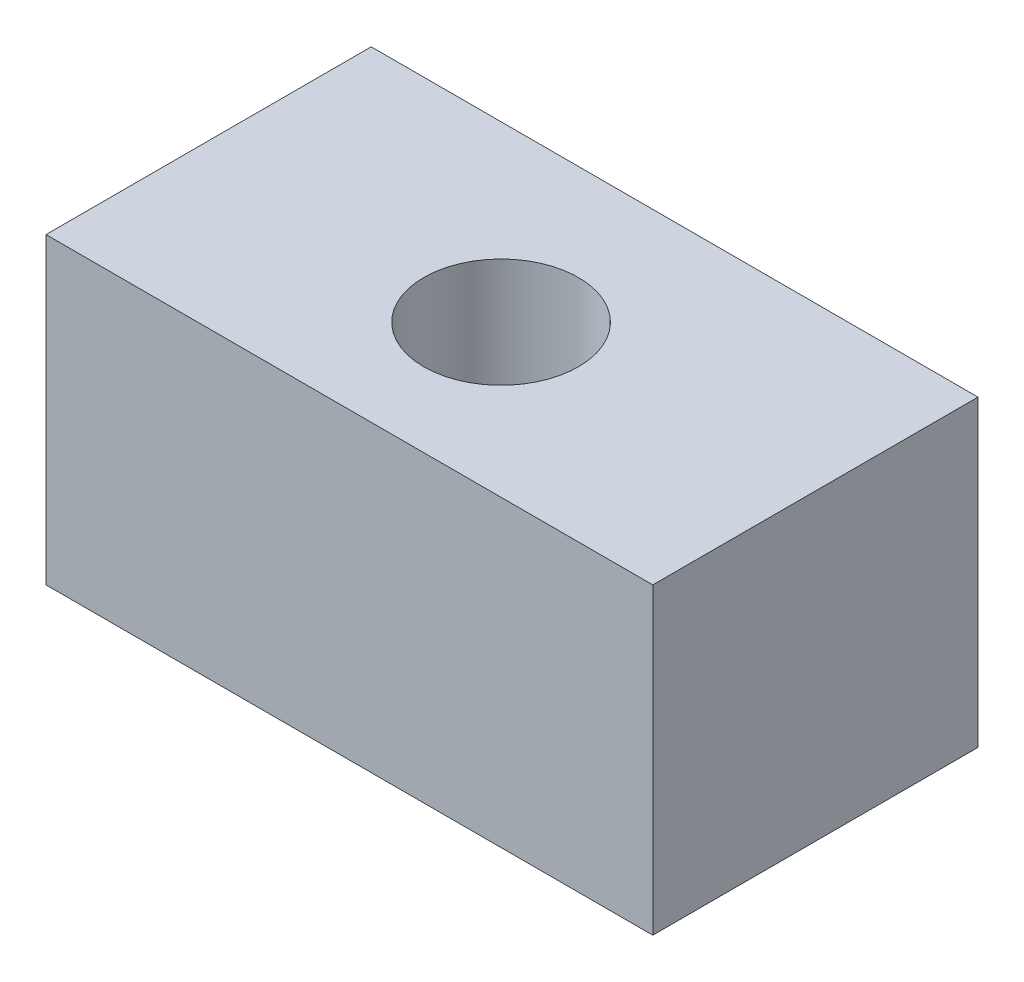
ISO-10303-21;
HEADER;
FILE_DESCRIPTION(('STEP AP214'),'2;1');
FILE_NAME('part.step','',(''),(''),'','','');
FILE_SCHEMA(('AUTOMOTIVE_DESIGN { 1 0 10303 214 1 1 1 1 }'));
ENDSEC;
DATA;
#1=APPLICATION_CONTEXT('core data for automotive mechanical design processes');
#2=APPLICATION_PROTOCOL_DEFINITION('international standard','automotive_design',2000,#1);
#3=PRODUCT_CONTEXT('',#1,'mechanical');
#4=PRODUCT('Part','Part','',(#3));
#5=PRODUCT_RELATED_PRODUCT_CATEGORY('part','',(#4));
#6=PRODUCT_DEFINITION_FORMATION('','',#4);
#7=PRODUCT_DEFINITION_CONTEXT('part definition',#1,'design');
#8=PRODUCT_DEFINITION('design','',#6,#7);
#9=PRODUCT_DEFINITION_SHAPE('','',#8);
#10=(LENGTH_UNIT() NAMED_UNIT(*) SI_UNIT(.MILLI.,.METRE.));
#11=(NAMED_UNIT(*) PLANE_ANGLE_UNIT() SI_UNIT($,.RADIAN.));
#12=(NAMED_UNIT(*) SI_UNIT($,.STERADIAN.) SOLID_ANGLE_UNIT());
#13=UNCERTAINTY_MEASURE_WITH_UNIT(LENGTH_MEASURE(1.E-05),#10,'distance_accuracy_value','');
#14=(GEOMETRIC_REPRESENTATION_CONTEXT(3) GLOBAL_UNCERTAINTY_ASSIGNED_CONTEXT((#13)) GLOBAL_UNIT_ASSIGNED_CONTEXT((#10,
#11,#12)) REPRESENTATION_CONTEXT('',''));
#15=CARTESIAN_POINT('',(0.,0.,0.));
#16=DIRECTION('',(0.,0.,1.));
#17=DIRECTION('',(1.,0.,0.));
#18=AXIS2_PLACEMENT_3D('',#15,#16,#17);
#19=CARTESIAN_POINT('',(-25.4,12.7,27.2288));
#20=DIRECTION('',(1.,0.,0.));
#21=DIRECTION('',(0.,0.,-1.));
#22=AXIS2_PLACEMENT_3D('',#19,#20,#21);
#23=PLANE('',#22);
#24=DIRECTION('',(0.,-1.,0.));
#25=VECTOR('',#24,1.);
#26=CARTESIAN_POINT('',(-25.4,12.7,0.));
#27=LINE('',#26,#25);
#28=CARTESIAN_POINT('',(-25.4,12.7,0.));
#29=VERTEX_POINT('',#28);
#30=CARTESIAN_POINT('',(-25.4,-12.7,0.));
#31=VERTEX_POINT('',#30);
#32=EDGE_CURVE('E113',#29,#31,#27,.T.);
#33=ORIENTED_EDGE('',*,*,#32,.T.);
#34=DIRECTION('',(0.,0.,-1.));
#35=VECTOR('',#34,1.);
#36=CARTESIAN_POINT('',(-25.4,-12.7,27.2288));
#37=LINE('',#36,#35);
#38=CARTESIAN_POINT('',(-25.4,-12.7,27.2288));
#39=VERTEX_POINT('',#38);
#40=EDGE_CURVE('E11',#39,#31,#37,.T.);
#41=ORIENTED_EDGE('',*,*,#40,.F.);
#42=DIRECTION('',(0.,-1.,0.));
#43=VECTOR('',#42,1.);
#44=CARTESIAN_POINT('',(-25.4,12.7,27.2288));
#45=LINE('',#44,#43);
#46=CARTESIAN_POINT('',(-25.4,12.7,27.2288));
#47=VERTEX_POINT('',#46);
#48=EDGE_CURVE('E97',#47,#39,#45,.T.);
#49=ORIENTED_EDGE('',*,*,#48,.F.);
#50=DIRECTION('',(0.,0.,-1.));
#51=VECTOR('',#50,1.);
#52=CARTESIAN_POINT('',(-25.4,12.7,27.2288));
#53=LINE('',#52,#51);
#54=EDGE_CURVE('E109',#47,#29,#53,.T.);
#55=ORIENTED_EDGE('',*,*,#54,.T.);
#56=EDGE_LOOP('',(#33,#41,#49,#55));
#57=FACE_BOUND('',#56,.T.);
#58=ADVANCED_FACE('F45',(#57),#23,.F.);
#59=CARTESIAN_POINT('',(-25.4,-12.7,27.2288));
#60=DIRECTION('',(0.,1.,0.));
#61=DIRECTION('',(0.,0.,1.));
#62=AXIS2_PLACEMENT_3D('',#59,#60,#61);
#63=PLANE('',#62);
#64=DIRECTION('',(1.,0.,0.));
#65=VECTOR('',#64,1.);
#66=CARTESIAN_POINT('',(-25.4,-12.7,0.));
#67=LINE('',#66,#65);
#68=CARTESIAN_POINT('',(25.4,-12.7,0.));
#69=VERTEX_POINT('',#68);
#70=EDGE_CURVE('E102',#31,#69,#67,.T.);
#71=ORIENTED_EDGE('',*,*,#70,.T.);
#72=DIRECTION('',(0.,0.,-1.));
#73=VECTOR('',#72,1.);
#74=CARTESIAN_POINT('',(25.4,-12.7,27.2288));
#75=LINE('',#74,#73);
#76=CARTESIAN_POINT('',(25.4,-12.7,27.2288));
#77=VERTEX_POINT('',#76);
#78=EDGE_CURVE('E54',#77,#69,#75,.T.);
#79=ORIENTED_EDGE('',*,*,#78,.F.);
#80=DIRECTION('',(1.,0.,0.));
#81=VECTOR('',#80,1.);
#82=CARTESIAN_POINT('',(-25.4,-12.7,27.2288));
#83=LINE('',#82,#81);
#84=EDGE_CURVE('E92',#39,#77,#83,.T.);
#85=ORIENTED_EDGE('',*,*,#84,.F.);
#86=ORIENTED_EDGE('',*,*,#40,.T.);
#87=EDGE_LOOP('',(#71,#79,#85,#86));
#88=FACE_BOUND('',#87,.T.);
#89=ADVANCED_FACE('F101',(#88),#63,.F.);
#90=CARTESIAN_POINT('',(25.4,12.7,27.2288));
#91=DIRECTION('',(-1.,0.,0.));
#92=DIRECTION('',(0.,0.,1.));
#93=AXIS2_PLACEMENT_3D('',#90,#91,#92);
#94=PLANE('',#93);
#95=DIRECTION('',(0.,1.,0.));
#96=VECTOR('',#95,1.);
#97=CARTESIAN_POINT('',(25.4,12.7,0.));
#98=LINE('',#97,#96);
#99=CARTESIAN_POINT('',(25.4,12.7,0.));
#100=VERTEX_POINT('',#99);
#101=EDGE_CURVE('E79',#69,#100,#98,.T.);
#102=ORIENTED_EDGE('',*,*,#101,.T.);
#103=DIRECTION('',(0.,0.,-1.));
#104=VECTOR('',#103,1.);
#105=CARTESIAN_POINT('',(25.4,12.7,27.2288));
#106=LINE('',#105,#104);
#107=CARTESIAN_POINT('',(25.4,12.7,27.2288));
#108=VERTEX_POINT('',#107);
#109=EDGE_CURVE('E104',#108,#100,#106,.T.);
#110=ORIENTED_EDGE('',*,*,#109,.F.);
#111=DIRECTION('',(0.,1.,0.));
#112=VECTOR('',#111,1.);
#113=CARTESIAN_POINT('',(25.4,12.7,27.2288));
#114=LINE('',#113,#112);
#115=EDGE_CURVE('E95',#77,#108,#114,.T.);
#116=ORIENTED_EDGE('',*,*,#115,.F.);
#117=ORIENTED_EDGE('',*,*,#78,.T.);
#118=EDGE_LOOP('',(#102,#110,#116,#117));
#119=FACE_BOUND('',#118,.T.);
#120=ADVANCED_FACE('F105',(#119),#94,.F.);
#121=CARTESIAN_POINT('',(-25.4,12.7,27.2288));
#122=DIRECTION('',(0.,-1.,0.));
#123=DIRECTION('',(0.,0.,-1.));
#124=AXIS2_PLACEMENT_3D('',#121,#122,#123);
#125=PLANE('',#124);
#126=CARTESIAN_POINT('',(0.,12.7,14.5288));
#127=DIRECTION('',(0.,1.,0.));
#128=DIRECTION('',(0.,0.,1.));
#129=AXIS2_PLACEMENT_3D('',#126,#127,#128);
#130=CIRCLE('',#129,6.477);
#131=CARTESIAN_POINT('',(0.,12.7,21.0058));
#132=VERTEX_POINT('',#131);
#133=EDGE_CURVE('E134',#132,#132,#130,.T.);
#134=ORIENTED_EDGE('',*,*,#133,.F.);
#135=EDGE_LOOP('',(#134));
#136=FACE_BOUND('',#135,.T.);
#137=DIRECTION('',(-1.,0.,0.));
#138=VECTOR('',#137,1.);
#139=CARTESIAN_POINT('',(-25.4,12.7,0.));
#140=LINE('',#139,#138);
#141=EDGE_CURVE('E85',#100,#29,#140,.T.);
#142=ORIENTED_EDGE('',*,*,#141,.T.);
#143=ORIENTED_EDGE('',*,*,#54,.F.);
#144=DIRECTION('',(-1.,0.,0.));
#145=VECTOR('',#144,1.);
#146=CARTESIAN_POINT('',(-25.4,12.7,27.2288));
#147=LINE('',#146,#145);
#148=EDGE_CURVE('E62',#108,#47,#147,.T.);
#149=ORIENTED_EDGE('',*,*,#148,.F.);
#150=ORIENTED_EDGE('',*,*,#109,.T.);
#151=EDGE_LOOP('',(#142,#143,#149,#150));
#152=FACE_BOUND('',#151,.T.);
#153=ADVANCED_FACE('F127',(#136,#152),#125,.F.);
#154=CARTESIAN_POINT('',(0.,0.,27.2288));
#155=DIRECTION('',(0.,0.,1.));
#156=DIRECTION('',(1.,0.,0.));
#157=AXIS2_PLACEMENT_3D('',#154,#155,#156);
#158=PLANE('',#157);
#159=ORIENTED_EDGE('',*,*,#48,.T.);
#160=ORIENTED_EDGE('',*,*,#84,.T.);
#161=ORIENTED_EDGE('',*,*,#115,.T.);
#162=ORIENTED_EDGE('',*,*,#148,.T.);
#163=EDGE_LOOP('',(#159,#160,#161,#162));
#164=FACE_BOUND('',#163,.T.);
#165=ADVANCED_FACE('F93',(#164),#158,.T.);
#166=CARTESIAN_POINT('',(0.,0.,0.));
#167=DIRECTION('',(0.,0.,1.));
#168=DIRECTION('',(1.,0.,0.));
#169=AXIS2_PLACEMENT_3D('',#166,#167,#168);
#170=PLANE('',#169);
#171=ORIENTED_EDGE('',*,*,#32,.F.);
#172=ORIENTED_EDGE('',*,*,#141,.F.);
#173=ORIENTED_EDGE('',*,*,#101,.F.);
#174=ORIENTED_EDGE('',*,*,#70,.F.);
#175=EDGE_LOOP('',(#171,#172,#173,#174));
#176=FACE_BOUND('',#175,.T.);
#177=ADVANCED_FACE('F130',(#176),#170,.F.);
#178=CARTESIAN_POINT('',(0.,-2.54,14.5288));
#179=DIRECTION('',(0.,1.,0.));
#180=DIRECTION('',(0.,0.,1.));
#181=AXIS2_PLACEMENT_3D('',#178,#179,#180);
#182=CYLINDRICAL_SURFACE('',#181,6.477);
#183=CARTESIAN_POINT('',(0.,-2.54,14.5288));
#184=DIRECTION('',(0.,1.,0.));
#185=DIRECTION('',(0.,0.,1.));
#186=AXIS2_PLACEMENT_3D('',#183,#184,#185);
#187=CIRCLE('',#186,6.477);
#188=CARTESIAN_POINT('',(0.,-2.54,21.0058));
#189=VERTEX_POINT('',#188);
#190=EDGE_CURVE('E117',#189,#189,#187,.T.);
#191=CARTESIAN_POINT('',(0.,-2.54,21.0058));
#192=CARTESIAN_POINT('',(0.,-2.38125,21.0058));
#193=CARTESIAN_POINT('',(0.,-2.2225,21.0058));
#194=CARTESIAN_POINT('',(0.,-1.905,21.0058));
#195=CARTESIAN_POINT('',(0.,-1.74625,21.0058));
#196=CARTESIAN_POINT('',(0.,-1.42875,21.0058));
#197=CARTESIAN_POINT('',(0.,-1.27,21.0058));
#198=CARTESIAN_POINT('',(0.,-0.952499999999999,21.0058));
#199=CARTESIAN_POINT('',(0.,-0.793749999999999,21.0058));
#200=CARTESIAN_POINT('',(0.,-0.476249999999999,21.0058));
#201=CARTESIAN_POINT('',(0.,-0.317499999999999,21.0058));
#202=CARTESIAN_POINT('',(0.,0.,21.0058));
#203=CARTESIAN_POINT('',(0.,0.158750000000001,21.0058));
#204=CARTESIAN_POINT('',(0.,0.476250000000001,21.0058));
#205=CARTESIAN_POINT('',(0.,0.635000000000001,21.0058));
#206=CARTESIAN_POINT('',(0.,0.952500000000001,21.0058));
#207=CARTESIAN_POINT('',(0.,1.11125,21.0058));
#208=CARTESIAN_POINT('',(0.,1.42875,21.0058));
#209=CARTESIAN_POINT('',(0.,1.5875,21.0058));
#210=CARTESIAN_POINT('',(0.,1.905,21.0058));
#211=CARTESIAN_POINT('',(0.,2.06375,21.0058));
#212=CARTESIAN_POINT('',(0.,2.38125,21.0058));
#213=CARTESIAN_POINT('',(0.,2.54,21.0058));
#214=CARTESIAN_POINT('',(0.,2.8575,21.0058));
#215=CARTESIAN_POINT('',(0.,3.01625,21.0058));
#216=CARTESIAN_POINT('',(0.,3.33375,21.0058));
#217=CARTESIAN_POINT('',(0.,3.4925,21.0058));
#218=CARTESIAN_POINT('',(0.,3.81,21.0058));
#219=CARTESIAN_POINT('',(0.,3.96875,21.0058));
#220=CARTESIAN_POINT('',(0.,4.28625,21.0058));
#221=CARTESIAN_POINT('',(0.,4.445,21.0058));
#222=CARTESIAN_POINT('',(0.,4.7625,21.0058));
#223=CARTESIAN_POINT('',(0.,4.92125,21.0058));
#224=CARTESIAN_POINT('',(0.,5.23875,21.0058));
#225=CARTESIAN_POINT('',(0.,5.3975,21.0058));
#226=CARTESIAN_POINT('',(0.,5.715,21.0058));
#227=CARTESIAN_POINT('',(0.,5.87375,21.0058));
#228=CARTESIAN_POINT('',(0.,6.19125,21.0058));
#229=CARTESIAN_POINT('',(0.,6.35,21.0058));
#230=CARTESIAN_POINT('',(0.,6.6675,21.0058));
#231=CARTESIAN_POINT('',(0.,6.82625,21.0058));
#232=CARTESIAN_POINT('',(0.,7.14375,21.0058));
#233=CARTESIAN_POINT('',(0.,7.3025,21.0058));
#234=CARTESIAN_POINT('',(0.,7.62,21.0058));
#235=CARTESIAN_POINT('',(0.,7.77875,21.0058));
#236=CARTESIAN_POINT('',(0.,8.09625,21.0058));
#237=CARTESIAN_POINT('',(0.,8.255,21.0058));
#238=CARTESIAN_POINT('',(0.,8.5725,21.0058));
#239=CARTESIAN_POINT('',(0.,8.73125,21.0058));
#240=CARTESIAN_POINT('',(0.,9.04875,21.0058));
#241=CARTESIAN_POINT('',(0.,9.2075,21.0058));
#242=CARTESIAN_POINT('',(0.,9.525,21.0058));
#243=CARTESIAN_POINT('',(0.,9.68375,21.0058));
#244=CARTESIAN_POINT('',(0.,10.00125,21.0058));
#245=CARTESIAN_POINT('',(0.,10.16,21.0058));
#246=CARTESIAN_POINT('',(0.,10.4775,21.0058));
#247=CARTESIAN_POINT('',(0.,10.63625,21.0058));
#248=CARTESIAN_POINT('',(0.,10.95375,21.0058));
#249=CARTESIAN_POINT('',(0.,11.1125,21.0058));
#250=CARTESIAN_POINT('',(0.,11.43,21.0058));
#251=CARTESIAN_POINT('',(0.,11.58875,21.0058));
#252=CARTESIAN_POINT('',(0.,11.90625,21.0058));
#253=CARTESIAN_POINT('',(0.,12.065,21.0058));
#254=CARTESIAN_POINT('',(0.,12.3825,21.0058));
#255=CARTESIAN_POINT('',(0.,12.54125,21.0058));
#256=CARTESIAN_POINT('',(0.,12.7,21.0058));
#257=B_SPLINE_CURVE_WITH_KNOTS('',3,(#191,#192,#193,#194,#195,#196,#197,#198,#199,#200,#201,
#202,#203,#204,#205,#206,#207,#208,#209,#210,#211,#212,#213,#214,#215,#216,#217,#218,#219,#220,
#221,#222,#223,#224,#225,#226,#227,#228,#229,#230,#231,#232,#233,#234,#235,#236,#237,#238,#239,
#240,#241,#242,#243,#244,#245,#246,#247,#248,#249,#250,#251,#252,#253,#254,#255,#256),
.UNSPECIFIED.,.F.,.F.,(4,2,2,2,2,2,2,2,2,2,2,2,2,2,2,2,2,2,2,2,2,2,2,2,2,2,2,2,2,2,2,2,4),(0.,
0.47625,0.9525,1.42875,1.905,2.38125,2.8575,3.33375,3.81,4.28625,4.7625,5.23875,5.715,6.19125,
6.6675,7.14375,7.62,8.09625,8.5725,9.04875,9.525,10.00125,10.4775,10.95375,11.43,11.90625,
12.3825,12.85875,13.335,13.81125,14.2875,14.76375,15.24),.UNSPECIFIED.);
#258=EDGE_CURVE('BSEAM144',#189,#132,#257,.T.);
#259=ORIENTED_EDGE('',*,*,#190,.F.);
#260=ORIENTED_EDGE('',*,*,#133,.T.);
#261=ORIENTED_EDGE('',*,*,#258,.T.);
#262=ORIENTED_EDGE('',*,*,#258,.F.);
#263=EDGE_LOOP('',(#259,#261,#260,#262));
#264=FACE_BOUND('',#263,.T.);
#265=ADVANCED_FACE('F144',(#264),#182,.F.);
#266=CARTESIAN_POINT('',(0.,-2.54,14.5288));
#267=DIRECTION('',(0.,1.,0.));
#268=DIRECTION('',(0.,0.,1.));
#269=AXIS2_PLACEMENT_3D('',#266,#267,#268);
#270=PLANE('',#269);
#271=ORIENTED_EDGE('',*,*,#190,.T.);
#272=EDGE_LOOP('',(#271));
#273=FACE_BOUND('',#272,.T.);
#274=ADVANCED_FACE('F142',(#273),#270,.T.);
#275=CLOSED_SHELL('',(#58,#89,#120,#153,#165,#177,#265,#274));
#276=MANIFOLD_SOLID_BREP('B2',#275);
#277=ADVANCED_BREP_SHAPE_REPRESENTATION('',(#18,#276),#14);
#278=SHAPE_DEFINITION_REPRESENTATION(#9,#277);
ENDSEC;
END-ISO-10303-21;
